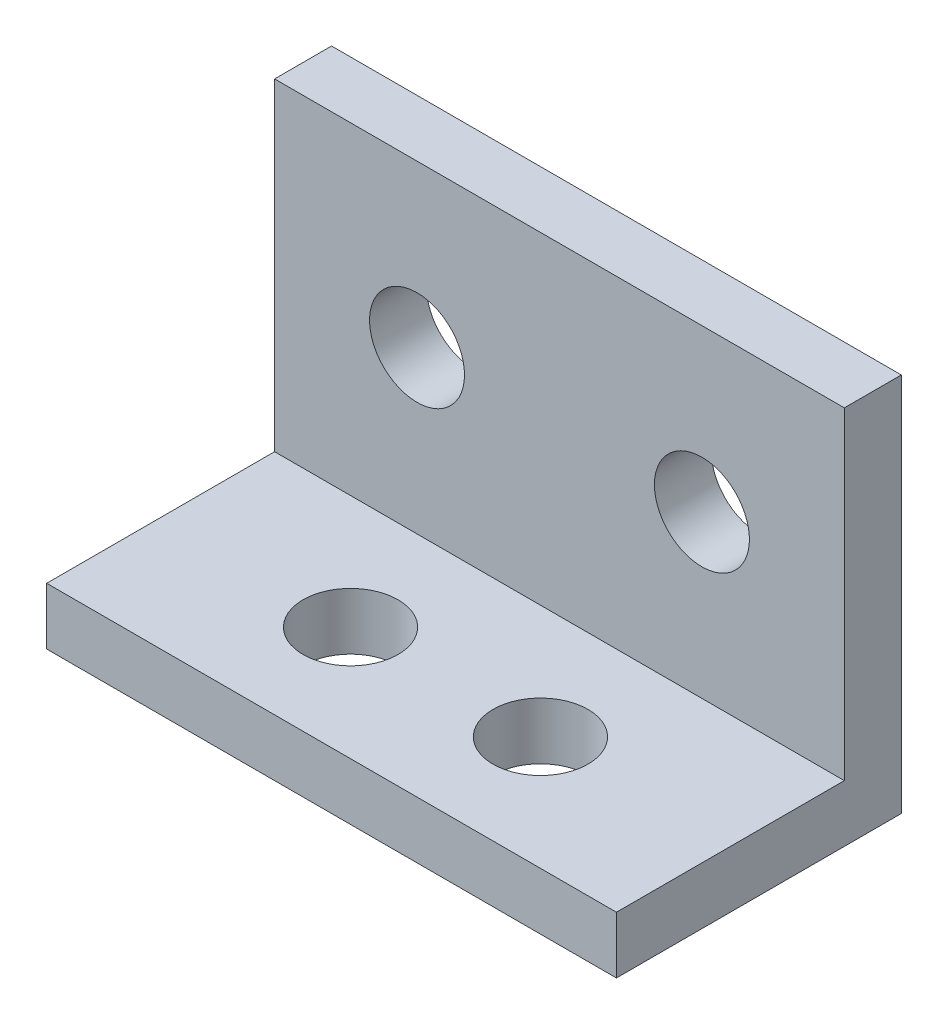
ISO-10303-21;
HEADER;
FILE_DESCRIPTION(('STEP AP214'),'2;1');
FILE_NAME('part.step','',(''),(''),'','','');
FILE_SCHEMA(('AUTOMOTIVE_DESIGN { 1 0 10303 214 1 1 1 1 }'));
ENDSEC;
DATA;
#1=APPLICATION_CONTEXT('core data for automotive mechanical design processes');
#2=APPLICATION_PROTOCOL_DEFINITION('international standard','automotive_design',2000,#1);
#3=PRODUCT_CONTEXT('',#1,'mechanical');
#4=PRODUCT('Part','Part','',(#3));
#5=PRODUCT_RELATED_PRODUCT_CATEGORY('part','',(#4));
#6=PRODUCT_DEFINITION_FORMATION('','',#4);
#7=PRODUCT_DEFINITION_CONTEXT('part definition',#1,'design');
#8=PRODUCT_DEFINITION('design','',#6,#7);
#9=PRODUCT_DEFINITION_SHAPE('','',#8);
#10=(LENGTH_UNIT() NAMED_UNIT(*) SI_UNIT(.MILLI.,.METRE.));
#11=(NAMED_UNIT(*) PLANE_ANGLE_UNIT() SI_UNIT($,.RADIAN.));
#12=(NAMED_UNIT(*) SI_UNIT($,.STERADIAN.) SOLID_ANGLE_UNIT());
#13=UNCERTAINTY_MEASURE_WITH_UNIT(LENGTH_MEASURE(1.E-05),#10,'distance_accuracy_value','');
#14=(GEOMETRIC_REPRESENTATION_CONTEXT(3) GLOBAL_UNCERTAINTY_ASSIGNED_CONTEXT((#13)) GLOBAL_UNIT_ASSIGNED_CONTEXT((#10,
#11,#12)) REPRESENTATION_CONTEXT('',''));
#15=CARTESIAN_POINT('',(0.,0.,0.));
#16=DIRECTION('',(0.,0.,1.));
#17=DIRECTION('',(1.,0.,0.));
#18=AXIS2_PLACEMENT_3D('',#15,#16,#17);
#19=CARTESIAN_POINT('',(38.1,0.,0.));
#20=DIRECTION('',(0.,0.,1.));
#21=DIRECTION('',(1.,0.,0.));
#22=AXIS2_PLACEMENT_3D('',#19,#20,#21);
#23=PLANE('',#22);
#24=CARTESIAN_POINT('',(9.52500000000001,14.605,0.));
#25=DIRECTION('',(0.,0.,1.));
#26=DIRECTION('',(1.,0.,0.));
#27=AXIS2_PLACEMENT_3D('',#24,#25,#26);
#28=CIRCLE('',#27,3.175);
#29=CARTESIAN_POINT('',(12.7,14.605,0.));
#30=VERTEX_POINT('',#29);
#31=EDGE_CURVE('E133',#30,#30,#28,.T.);
#32=ORIENTED_EDGE('',*,*,#31,.T.);
#33=EDGE_LOOP('',(#32));
#34=FACE_BOUND('',#33,.T.);
#35=CARTESIAN_POINT('',(28.575,14.605,0.));
#36=DIRECTION('',(0.,0.,1.));
#37=DIRECTION('',(-1.,0.,0.));
#38=AXIS2_PLACEMENT_3D('',#35,#36,#37);
#39=CIRCLE('',#38,3.17499999999998);
#40=CARTESIAN_POINT('',(25.4,14.605,0.));
#41=VERTEX_POINT('',#40);
#42=EDGE_CURVE('E186',#41,#41,#39,.T.);
#43=ORIENTED_EDGE('',*,*,#42,.T.);
#44=EDGE_LOOP('',(#43));
#45=FACE_BOUND('',#44,.T.);
#46=DIRECTION('',(0.,1.,0.));
#47=VECTOR('',#46,1.);
#48=CARTESIAN_POINT('',(0.,0.,0.));
#49=LINE('',#48,#47);
#50=CARTESIAN_POINT('',(0.,0.,0.));
#51=VERTEX_POINT('',#50);
#52=CARTESIAN_POINT('',(0.,25.4,0.));
#53=VERTEX_POINT('',#52);
#54=EDGE_CURVE('E128',#51,#53,#49,.T.);
#55=ORIENTED_EDGE('',*,*,#54,.T.);
#56=DIRECTION('',(-1.,0.,0.));
#57=VECTOR('',#56,1.);
#58=CARTESIAN_POINT('',(38.1,25.4,0.));
#59=LINE('',#58,#57);
#60=CARTESIAN_POINT('',(38.1,25.4,0.));
#61=VERTEX_POINT('',#60);
#62=EDGE_CURVE('E11',#61,#53,#59,.T.);
#63=ORIENTED_EDGE('',*,*,#62,.F.);
#64=DIRECTION('',(0.,1.,0.));
#65=VECTOR('',#64,1.);
#66=CARTESIAN_POINT('',(38.1,0.,0.));
#67=LINE('',#66,#65);
#68=CARTESIAN_POINT('',(38.1,0.,0.));
#69=VERTEX_POINT('',#68);
#70=EDGE_CURVE('E145',#69,#61,#67,.T.);
#71=ORIENTED_EDGE('',*,*,#70,.F.);
#72=DIRECTION('',(-1.,0.,0.));
#73=VECTOR('',#72,1.);
#74=CARTESIAN_POINT('',(38.1,0.,0.));
#75=LINE('',#74,#73);
#76=EDGE_CURVE('E124',#69,#51,#75,.T.);
#77=ORIENTED_EDGE('',*,*,#76,.T.);
#78=EDGE_LOOP('',(#55,#63,#71,#77));
#79=FACE_BOUND('',#78,.T.);
#80=ADVANCED_FACE('F39',(#34,#45,#79),#23,.F.);
#81=CARTESIAN_POINT('',(38.1,25.4,0.));
#82=DIRECTION('',(0.,-1.,0.));
#83=DIRECTION('',(0.,0.,-1.));
#84=AXIS2_PLACEMENT_3D('',#81,#82,#83);
#85=PLANE('',#84);
#86=DIRECTION('',(0.,0.,1.));
#87=VECTOR('',#86,1.);
#88=CARTESIAN_POINT('',(0.,25.4,0.));
#89=LINE('',#88,#87);
#90=CARTESIAN_POINT('',(0.,25.4,3.81));
#91=VERTEX_POINT('',#90);
#92=EDGE_CURVE('E132',#53,#91,#89,.T.);
#93=ORIENTED_EDGE('',*,*,#92,.T.);
#94=DIRECTION('',(-1.,0.,0.));
#95=VECTOR('',#94,1.);
#96=CARTESIAN_POINT('',(38.1,25.4,3.81));
#97=LINE('',#96,#95);
#98=CARTESIAN_POINT('',(38.1,25.4,3.81));
#99=VERTEX_POINT('',#98);
#100=EDGE_CURVE('E48',#99,#91,#97,.T.);
#101=ORIENTED_EDGE('',*,*,#100,.F.);
#102=DIRECTION('',(0.,0.,1.));
#103=VECTOR('',#102,1.);
#104=CARTESIAN_POINT('',(38.1,25.4,0.));
#105=LINE('',#104,#103);
#106=EDGE_CURVE('E93',#61,#99,#105,.T.);
#107=ORIENTED_EDGE('',*,*,#106,.F.);
#108=ORIENTED_EDGE('',*,*,#62,.T.);
#109=EDGE_LOOP('',(#93,#101,#107,#108));
#110=FACE_BOUND('',#109,.T.);
#111=ADVANCED_FACE('F176',(#110),#85,.F.);
#112=CARTESIAN_POINT('',(38.1,25.4,3.81));
#113=DIRECTION('',(0.,0.,-1.));
#114=DIRECTION('',(0.,1.,0.));
#115=AXIS2_PLACEMENT_3D('',#112,#113,#114);
#116=PLANE('',#115);
#117=CARTESIAN_POINT('',(9.52500000000001,14.605,3.81));
#118=DIRECTION('',(0.,0.,1.));
#119=DIRECTION('',(1.,0.,0.));
#120=AXIS2_PLACEMENT_3D('',#117,#118,#119);
#121=CIRCLE('',#120,3.175);
#122=CARTESIAN_POINT('',(12.7,14.605,3.81));
#123=VERTEX_POINT('',#122);
#124=EDGE_CURVE('E189',#123,#123,#121,.T.);
#125=ORIENTED_EDGE('',*,*,#124,.F.);
#126=EDGE_LOOP('',(#125));
#127=FACE_BOUND('',#126,.T.);
#128=CARTESIAN_POINT('',(28.575,14.605,3.81));
#129=DIRECTION('',(0.,0.,1.));
#130=DIRECTION('',(-1.,0.,0.));
#131=AXIS2_PLACEMENT_3D('',#128,#129,#130);
#132=CIRCLE('',#131,3.17499999999998);
#133=CARTESIAN_POINT('',(25.4,14.605,3.81));
#134=VERTEX_POINT('',#133);
#135=EDGE_CURVE('E190',#134,#134,#132,.T.);
#136=ORIENTED_EDGE('',*,*,#135,.F.);
#137=EDGE_LOOP('',(#136));
#138=FACE_BOUND('',#137,.T.);
#139=DIRECTION('',(0.,-1.,0.));
#140=VECTOR('',#139,1.);
#141=CARTESIAN_POINT('',(0.,25.4,3.81));
#142=LINE('',#141,#140);
#143=CARTESIAN_POINT('',(0.,3.81,3.81));
#144=VERTEX_POINT('',#143);
#145=EDGE_CURVE('E136',#91,#144,#142,.T.);
#146=ORIENTED_EDGE('',*,*,#145,.T.);
#147=DIRECTION('',(-1.,0.,0.));
#148=VECTOR('',#147,1.);
#149=CARTESIAN_POINT('',(38.1,3.81,3.81));
#150=LINE('',#149,#148);
#151=CARTESIAN_POINT('',(38.1,3.81,3.81));
#152=VERTEX_POINT('',#151);
#153=EDGE_CURVE('E117',#152,#144,#150,.T.);
#154=ORIENTED_EDGE('',*,*,#153,.F.);
#155=DIRECTION('',(0.,-1.,0.));
#156=VECTOR('',#155,1.);
#157=CARTESIAN_POINT('',(38.1,25.4,3.81));
#158=LINE('',#157,#156);
#159=EDGE_CURVE('E106',#99,#152,#158,.T.);
#160=ORIENTED_EDGE('',*,*,#159,.F.);
#161=ORIENTED_EDGE('',*,*,#100,.T.);
#162=EDGE_LOOP('',(#146,#154,#160,#161));
#163=FACE_BOUND('',#162,.T.);
#164=ADVANCED_FACE('F155',(#127,#138,#163),#116,.F.);
#165=CARTESIAN_POINT('',(38.1,3.80999999999999,19.05));
#166=DIRECTION('',(0.,-1.,0.));
#167=DIRECTION('',(0.,0.,-1.));
#168=AXIS2_PLACEMENT_3D('',#165,#166,#167);
#169=PLANE('',#168);
#170=CARTESIAN_POINT('',(12.7,3.81,11.43));
#171=DIRECTION('',(0.,-1.,0.));
#172=DIRECTION('',(0.,0.,-1.));
#173=AXIS2_PLACEMENT_3D('',#170,#171,#172);
#174=CIRCLE('',#173,3.175);
#175=CARTESIAN_POINT('',(12.7,3.81,8.255));
#176=VERTEX_POINT('',#175);
#177=EDGE_CURVE('E197',#176,#176,#174,.T.);
#178=ORIENTED_EDGE('',*,*,#177,.T.);
#179=EDGE_LOOP('',(#178));
#180=FACE_BOUND('',#179,.T.);
#181=CARTESIAN_POINT('',(25.4,3.81,11.43));
#182=DIRECTION('',(0.,-1.,0.));
#183=DIRECTION('',(0.,0.,-1.));
#184=AXIS2_PLACEMENT_3D('',#181,#182,#183);
#185=CIRCLE('',#184,3.175);
#186=CARTESIAN_POINT('',(25.4,3.81,8.255));
#187=VERTEX_POINT('',#186);
#188=EDGE_CURVE('E210',#187,#187,#185,.T.);
#189=ORIENTED_EDGE('',*,*,#188,.T.);
#190=EDGE_LOOP('',(#189));
#191=FACE_BOUND('',#190,.T.);
#192=DIRECTION('',(0.,0.,1.));
#193=VECTOR('',#192,1.);
#194=CARTESIAN_POINT('',(0.,3.80999999999999,19.05));
#195=LINE('',#194,#193);
#196=CARTESIAN_POINT('',(0.,3.80999999999999,19.05));
#197=VERTEX_POINT('',#196);
#198=EDGE_CURVE('E115',#144,#197,#195,.T.);
#199=ORIENTED_EDGE('',*,*,#198,.T.);
#200=DIRECTION('',(-1.,0.,0.));
#201=VECTOR('',#200,1.);
#202=CARTESIAN_POINT('',(38.1,3.80999999999999,19.05));
#203=LINE('',#202,#201);
#204=CARTESIAN_POINT('',(38.1,3.80999999999999,19.05));
#205=VERTEX_POINT('',#204);
#206=EDGE_CURVE('E112',#205,#197,#203,.T.);
#207=ORIENTED_EDGE('',*,*,#206,.F.);
#208=DIRECTION('',(0.,0.,1.));
#209=VECTOR('',#208,1.);
#210=CARTESIAN_POINT('',(38.1,3.80999999999999,19.05));
#211=LINE('',#210,#209);
#212=EDGE_CURVE('E100',#152,#205,#211,.T.);
#213=ORIENTED_EDGE('',*,*,#212,.F.);
#214=ORIENTED_EDGE('',*,*,#153,.T.);
#215=EDGE_LOOP('',(#199,#207,#213,#214));
#216=FACE_BOUND('',#215,.T.);
#217=ADVANCED_FACE('F113',(#180,#191,#216),#169,.F.);
#218=CARTESIAN_POINT('',(38.1,0.,19.05));
#219=DIRECTION('',(0.,0.,-1.));
#220=DIRECTION('',(-1.,0.,0.));
#221=AXIS2_PLACEMENT_3D('',#218,#219,#220);
#222=PLANE('',#221);
#223=DIRECTION('',(0.,-1.,0.));
#224=VECTOR('',#223,1.);
#225=CARTESIAN_POINT('',(0.,0.,19.05));
#226=LINE('',#225,#224);
#227=CARTESIAN_POINT('',(0.,0.,19.05));
#228=VERTEX_POINT('',#227);
#229=EDGE_CURVE('E79',#197,#228,#226,.T.);
#230=ORIENTED_EDGE('',*,*,#229,.T.);
#231=DIRECTION('',(-1.,0.,0.));
#232=VECTOR('',#231,1.);
#233=CARTESIAN_POINT('',(38.1,0.,19.05));
#234=LINE('',#233,#232);
#235=CARTESIAN_POINT('',(38.1,0.,19.05));
#236=VERTEX_POINT('',#235);
#237=EDGE_CURVE('E118',#236,#228,#234,.T.);
#238=ORIENTED_EDGE('',*,*,#237,.F.);
#239=DIRECTION('',(0.,-1.,0.));
#240=VECTOR('',#239,1.);
#241=CARTESIAN_POINT('',(38.1,0.,19.05));
#242=LINE('',#241,#240);
#243=EDGE_CURVE('E104',#205,#236,#242,.T.);
#244=ORIENTED_EDGE('',*,*,#243,.F.);
#245=ORIENTED_EDGE('',*,*,#206,.T.);
#246=EDGE_LOOP('',(#230,#238,#244,#245));
#247=FACE_BOUND('',#246,.T.);
#248=ADVANCED_FACE('F120',(#247),#222,.F.);
#249=CARTESIAN_POINT('',(38.1,0.,0.));
#250=DIRECTION('',(0.,1.,0.));
#251=DIRECTION('',(0.,0.,1.));
#252=AXIS2_PLACEMENT_3D('',#249,#250,#251);
#253=PLANE('',#252);
#254=CARTESIAN_POINT('',(12.7,0.,11.43));
#255=DIRECTION('',(0.,-1.,0.));
#256=DIRECTION('',(0.,0.,-1.));
#257=AXIS2_PLACEMENT_3D('',#254,#255,#256);
#258=CIRCLE('',#257,3.175);
#259=CARTESIAN_POINT('',(12.7,0.,8.255));
#260=VERTEX_POINT('',#259);
#261=EDGE_CURVE('E214',#260,#260,#258,.T.);
#262=ORIENTED_EDGE('',*,*,#261,.F.);
#263=EDGE_LOOP('',(#262));
#264=FACE_BOUND('',#263,.T.);
#265=CARTESIAN_POINT('',(25.4,0.,11.43));
#266=DIRECTION('',(0.,-1.,0.));
#267=DIRECTION('',(0.,0.,-1.));
#268=AXIS2_PLACEMENT_3D('',#265,#266,#267);
#269=CIRCLE('',#268,3.175);
#270=CARTESIAN_POINT('',(25.4,0.,8.255));
#271=VERTEX_POINT('',#270);
#272=EDGE_CURVE('E215',#271,#271,#269,.T.);
#273=ORIENTED_EDGE('',*,*,#272,.F.);
#274=EDGE_LOOP('',(#273));
#275=FACE_BOUND('',#274,.T.);
#276=DIRECTION('',(0.,0.,-1.));
#277=VECTOR('',#276,1.);
#278=CARTESIAN_POINT('',(0.,0.,0.));
#279=LINE('',#278,#277);
#280=EDGE_CURVE('E85',#228,#51,#279,.T.);
#281=ORIENTED_EDGE('',*,*,#280,.T.);
#282=ORIENTED_EDGE('',*,*,#76,.F.);
#283=DIRECTION('',(0.,0.,-1.));
#284=VECTOR('',#283,1.);
#285=CARTESIAN_POINT('',(38.1,0.,0.));
#286=LINE('',#285,#284);
#287=EDGE_CURVE('E56',#236,#69,#286,.T.);
#288=ORIENTED_EDGE('',*,*,#287,.F.);
#289=ORIENTED_EDGE('',*,*,#237,.T.);
#290=EDGE_LOOP('',(#281,#282,#288,#289));
#291=FACE_BOUND('',#290,.T.);
#292=ADVANCED_FACE('F162',(#264,#275,#291),#253,.F.);
#293=CARTESIAN_POINT('',(38.1,0.,0.));
#294=DIRECTION('',(1.,0.,0.));
#295=DIRECTION('',(0.,0.,-1.));
#296=AXIS2_PLACEMENT_3D('',#293,#294,#295);
#297=PLANE('',#296);
#298=ORIENTED_EDGE('',*,*,#70,.T.);
#299=ORIENTED_EDGE('',*,*,#106,.T.);
#300=ORIENTED_EDGE('',*,*,#159,.T.);
#301=ORIENTED_EDGE('',*,*,#212,.T.);
#302=ORIENTED_EDGE('',*,*,#243,.T.);
#303=ORIENTED_EDGE('',*,*,#287,.T.);
#304=EDGE_LOOP('',(#298,#299,#300,#301,#302,#303));
#305=FACE_BOUND('',#304,.T.);
#306=ADVANCED_FACE('F102',(#305),#297,.T.);
#307=CARTESIAN_POINT('',(0.,0.,0.));
#308=DIRECTION('',(1.,0.,0.));
#309=DIRECTION('',(0.,0.,-1.));
#310=AXIS2_PLACEMENT_3D('',#307,#308,#309);
#311=PLANE('',#310);
#312=ORIENTED_EDGE('',*,*,#54,.F.);
#313=ORIENTED_EDGE('',*,*,#280,.F.);
#314=ORIENTED_EDGE('',*,*,#229,.F.);
#315=ORIENTED_EDGE('',*,*,#198,.F.);
#316=ORIENTED_EDGE('',*,*,#145,.F.);
#317=ORIENTED_EDGE('',*,*,#92,.F.);
#318=EDGE_LOOP('',(#312,#313,#314,#315,#316,#317));
#319=FACE_BOUND('',#318,.T.);
#320=ADVANCED_FACE('F158',(#319),#311,.F.);
#321=CARTESIAN_POINT('',(28.575,14.605,0.));
#322=DIRECTION('',(0.,0.,1.));
#323=DIRECTION('',(1.,0.,0.));
#324=AXIS2_PLACEMENT_3D('',#321,#322,#323);
#325=CYLINDRICAL_SURFACE('',#324,3.17499999999998);
#326=ORIENTED_EDGE('',*,*,#42,.F.);
#327=EDGE_LOOP('',(#326));
#328=FACE_BOUND('',#327,.T.);
#329=ORIENTED_EDGE('',*,*,#135,.T.);
#330=EDGE_LOOP('',(#329));
#331=FACE_BOUND('',#330,.T.);
#332=ADVANCED_FACE('F241',(#328,#331),#325,.F.);
#333=CARTESIAN_POINT('',(9.52500000000001,14.605,0.));
#334=DIRECTION('',(0.,0.,1.));
#335=DIRECTION('',(1.,0.,0.));
#336=AXIS2_PLACEMENT_3D('',#333,#334,#335);
#337=CYLINDRICAL_SURFACE('',#336,3.175);
#338=ORIENTED_EDGE('',*,*,#31,.F.);
#339=EDGE_LOOP('',(#338));
#340=FACE_BOUND('',#339,.T.);
#341=ORIENTED_EDGE('',*,*,#124,.T.);
#342=EDGE_LOOP('',(#341));
#343=FACE_BOUND('',#342,.T.);
#344=ADVANCED_FACE('F235',(#340,#343),#337,.F.);
#345=CARTESIAN_POINT('',(25.4,25.4,11.43));
#346=DIRECTION('',(0.,-1.,0.));
#347=DIRECTION('',(0.,0.,-1.));
#348=AXIS2_PLACEMENT_3D('',#345,#346,#347);
#349=CYLINDRICAL_SURFACE('',#348,3.175);
#350=ORIENTED_EDGE('',*,*,#272,.T.);
#351=EDGE_LOOP('',(#350));
#352=FACE_BOUND('',#351,.T.);
#353=ORIENTED_EDGE('',*,*,#188,.F.);
#354=EDGE_LOOP('',(#353));
#355=FACE_BOUND('',#354,.T.);
#356=ADVANCED_FACE('F225',(#352,#355),#349,.F.);
#357=CARTESIAN_POINT('',(12.7,25.4,11.43));
#358=DIRECTION('',(0.,-1.,0.));
#359=DIRECTION('',(0.,0.,-1.));
#360=AXIS2_PLACEMENT_3D('',#357,#358,#359);
#361=CYLINDRICAL_SURFACE('',#360,3.175);
#362=ORIENTED_EDGE('',*,*,#261,.T.);
#363=EDGE_LOOP('',(#362));
#364=FACE_BOUND('',#363,.T.);
#365=ORIENTED_EDGE('',*,*,#177,.F.);
#366=EDGE_LOOP('',(#365));
#367=FACE_BOUND('',#366,.T.);
#368=ADVANCED_FACE('F222',(#364,#367),#361,.F.);
#369=CLOSED_SHELL('',(#80,#111,#164,#217,#248,#292,#306,#320,#332,#344,#356,#368));
#370=MANIFOLD_SOLID_BREP('B2',#369);
#371=ADVANCED_BREP_SHAPE_REPRESENTATION('',(#18,#370),#14);
#372=SHAPE_DEFINITION_REPRESENTATION(#9,#371);
ENDSEC;
END-ISO-10303-21;
